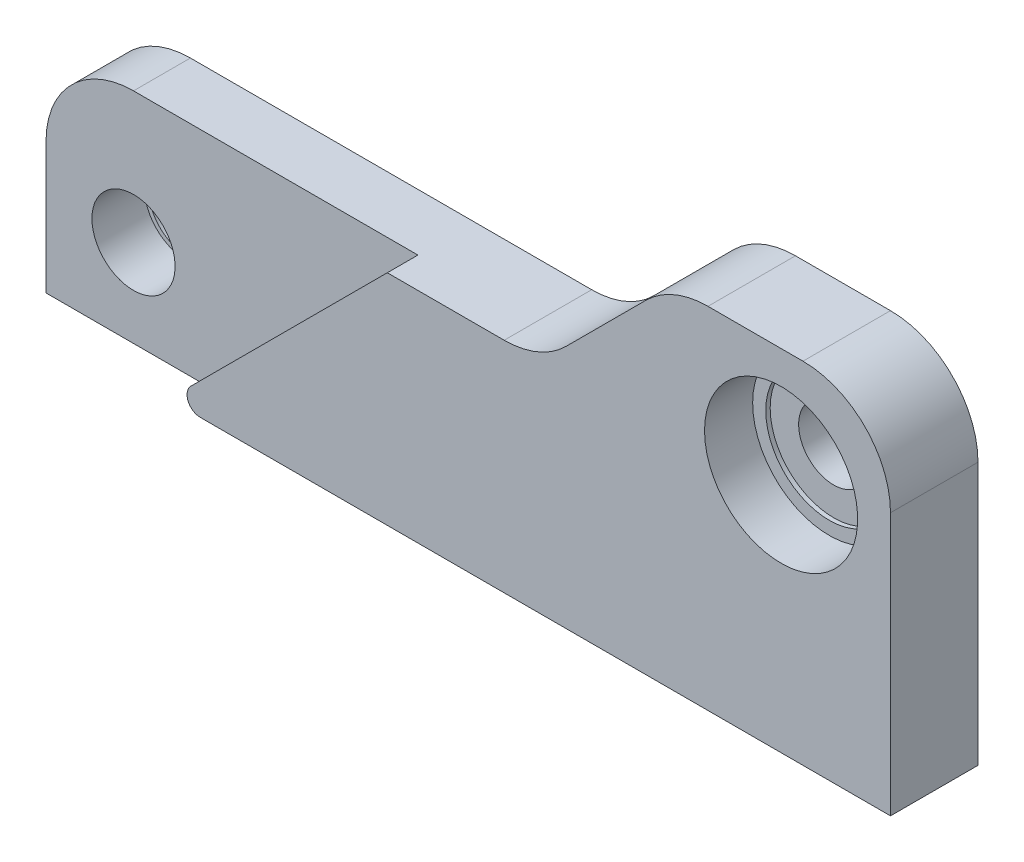
ISO-10303-21;
HEADER;
FILE_DESCRIPTION(('STEP AP214'),'2;1');
FILE_NAME('part.step','',(''),(''),'','','');
FILE_SCHEMA(('AUTOMOTIVE_DESIGN { 1 0 10303 214 1 1 1 1 }'));
ENDSEC;
DATA;
#1=APPLICATION_CONTEXT('core data for automotive mechanical design processes');
#2=APPLICATION_PROTOCOL_DEFINITION('international standard','automotive_design',2000,#1);
#3=PRODUCT_CONTEXT('',#1,'mechanical');
#4=PRODUCT('Part','Part','',(#3));
#5=PRODUCT_RELATED_PRODUCT_CATEGORY('part','',(#4));
#6=PRODUCT_DEFINITION_FORMATION('','',#4);
#7=PRODUCT_DEFINITION_CONTEXT('part definition',#1,'design');
#8=PRODUCT_DEFINITION('design','',#6,#7);
#9=PRODUCT_DEFINITION_SHAPE('','',#8);
#10=(LENGTH_UNIT() NAMED_UNIT(*) SI_UNIT(.MILLI.,.METRE.));
#11=(NAMED_UNIT(*) PLANE_ANGLE_UNIT() SI_UNIT($,.RADIAN.));
#12=(NAMED_UNIT(*) SI_UNIT($,.STERADIAN.) SOLID_ANGLE_UNIT());
#13=UNCERTAINTY_MEASURE_WITH_UNIT(LENGTH_MEASURE(1.E-05),#10,'distance_accuracy_value','');
#14=(GEOMETRIC_REPRESENTATION_CONTEXT(3) GLOBAL_UNCERTAINTY_ASSIGNED_CONTEXT((#13)) GLOBAL_UNIT_ASSIGNED_CONTEXT((#10,
#11,#12)) REPRESENTATION_CONTEXT('',''));
#15=CARTESIAN_POINT('',(0.,0.,0.));
#16=DIRECTION('',(0.,0.,1.));
#17=DIRECTION('',(1.,0.,0.));
#18=AXIS2_PLACEMENT_3D('',#15,#16,#17);
#19=CARTESIAN_POINT('',(175.,55.,-20.));
#20=DIRECTION('',(0.,0.,1.));
#21=DIRECTION('',(-1.,0.,0.));
#22=AXIS2_PLACEMENT_3D('',#19,#20,#21);
#23=CYLINDRICAL_SURFACE('',#22,8.00000000000001);
#24=CARTESIAN_POINT('',(175.,55.,-20.));
#25=DIRECTION('',(0.,0.,-1.));
#26=DIRECTION('',(-1.,0.,0.));
#27=AXIS2_PLACEMENT_3D('',#24,#25,#26);
#28=CIRCLE('',#27,8.00000000000001);
#29=CARTESIAN_POINT('',(167.,55.,-20.));
#30=VERTEX_POINT('',#29);
#31=EDGE_CURVE('E179',#30,#30,#28,.T.);
#32=ORIENTED_EDGE('',*,*,#31,.T.);
#33=EDGE_LOOP('',(#32));
#34=FACE_BOUND('',#33,.T.);
#35=CARTESIAN_POINT('',(175.,55.,-12.));
#36=DIRECTION('',(0.,0.,-1.));
#37=DIRECTION('',(-1.,0.,0.));
#38=AXIS2_PLACEMENT_3D('',#35,#36,#37);
#39=CIRCLE('',#38,8.00000000000001);
#40=CARTESIAN_POINT('',(167.,55.,-12.));
#41=VERTEX_POINT('',#40);
#42=EDGE_CURVE('E176',#41,#41,#39,.F.);
#43=ORIENTED_EDGE('',*,*,#42,.T.);
#44=EDGE_LOOP('',(#43));
#45=FACE_BOUND('',#44,.T.);
#46=ADVANCED_FACE('F35',(#34,#45),#23,.F.);
#47=CARTESIAN_POINT('',(0.,0.,-20.));
#48=DIRECTION('',(1.,0.,0.));
#49=DIRECTION('',(0.,0.,1.));
#50=AXIS2_PLACEMENT_3D('',#47,#48,#49);
#51=PLANE('',#50);
#52=DIRECTION('',(0.,-1.,0.));
#53=VECTOR('',#52,1.);
#54=CARTESIAN_POINT('',(0.,0.,-20.));
#55=LINE('',#54,#53);
#56=CARTESIAN_POINT('',(0.,30.,-20.));
#57=VERTEX_POINT('',#56);
#58=CARTESIAN_POINT('',(0.,0.,-20.));
#59=VERTEX_POINT('',#58);
#60=EDGE_CURVE('E189',#57,#59,#55,.T.);
#61=ORIENTED_EDGE('',*,*,#60,.T.);
#62=DIRECTION('',(0.,0.,1.));
#63=VECTOR('',#62,1.);
#64=CARTESIAN_POINT('',(0.,0.,-20.));
#65=LINE('',#64,#63);
#66=CARTESIAN_POINT('',(0.,0.,-7.));
#67=VERTEX_POINT('',#66);
#68=EDGE_CURVE('E212',#59,#67,#65,.T.);
#69=ORIENTED_EDGE('',*,*,#68,.T.);
#70=DIRECTION('',(0.,1.,0.));
#71=VECTOR('',#70,1.);
#72=CARTESIAN_POINT('',(0.,50.,-7.));
#73=LINE('',#72,#71);
#74=CARTESIAN_POINT('',(0.,30.,-7.));
#75=VERTEX_POINT('',#74);
#76=EDGE_CURVE('E156',#67,#75,#73,.T.);
#77=ORIENTED_EDGE('',*,*,#76,.T.);
#78=DIRECTION('',(0.,0.,-1.));
#79=VECTOR('',#78,1.);
#80=CARTESIAN_POINT('',(0.,30.,-20.));
#81=LINE('',#80,#79);
#82=EDGE_CURVE('E225',#57,#75,#81,.F.);
#83=ORIENTED_EDGE('',*,*,#82,.F.);
#84=EDGE_LOOP('',(#61,#69,#77,#83));
#85=FACE_BOUND('',#84,.T.);
#86=ADVANCED_FACE('F294',(#85),#51,.F.);
#87=CARTESIAN_POINT('',(0.,0.,-20.));
#88=DIRECTION('',(0.,1.,0.));
#89=DIRECTION('',(0.,0.,-1.));
#90=AXIS2_PLACEMENT_3D('',#87,#88,#89);
#91=PLANE('',#90);
#92=DIRECTION('',(-1.,0.,0.));
#93=VECTOR('',#92,1.);
#94=CARTESIAN_POINT('',(0.,0.,-7.));
#95=LINE('',#94,#93);
#96=CARTESIAN_POINT('',(42.2426406871193,0.,-7.));
#97=VERTEX_POINT('',#96);
#98=EDGE_CURVE('E141',#97,#67,#95,.T.);
#99=ORIENTED_EDGE('',*,*,#98,.T.);
#100=ORIENTED_EDGE('',*,*,#68,.F.);
#101=DIRECTION('',(1.,0.,0.));
#102=VECTOR('',#101,1.);
#103=CARTESIAN_POINT('',(0.,0.,-20.));
#104=LINE('',#103,#102);
#105=CARTESIAN_POINT('',(200.,0.,-20.));
#106=VERTEX_POINT('',#105);
#107=EDGE_CURVE('E192',#59,#106,#104,.T.);
#108=ORIENTED_EDGE('',*,*,#107,.T.);
#109=DIRECTION('',(0.,0.,1.));
#110=VECTOR('',#109,1.);
#111=CARTESIAN_POINT('',(200.,0.,-20.));
#112=LINE('',#111,#110);
#113=CARTESIAN_POINT('',(200.,0.,0.));
#114=VERTEX_POINT('',#113);
#115=EDGE_CURVE('E202',#106,#114,#112,.T.);
#116=ORIENTED_EDGE('',*,*,#115,.T.);
#117=DIRECTION('',(1.,0.,0.));
#118=VECTOR('',#117,1.);
#119=CARTESIAN_POINT('',(0.,0.,0.));
#120=LINE('',#119,#118);
#121=CARTESIAN_POINT('',(42.2426406871193,0.,0.));
#122=VERTEX_POINT('',#121);
#123=EDGE_CURVE('E186',#122,#114,#120,.T.);
#124=ORIENTED_EDGE('',*,*,#123,.F.);
#125=DIRECTION('',(0.,0.,1.));
#126=VECTOR('',#125,1.);
#127=CARTESIAN_POINT('',(42.2426406871193,0.,-20.));
#128=LINE('',#127,#126);
#129=EDGE_CURVE('E230',#97,#122,#128,.T.);
#130=ORIENTED_EDGE('',*,*,#129,.F.);
#131=EDGE_LOOP('',(#99,#100,#108,#116,#124,#130));
#132=FACE_BOUND('',#131,.T.);
#133=ADVANCED_FACE('F290',(#132),#91,.F.);
#134=CARTESIAN_POINT('',(200.,0.,-20.));
#135=DIRECTION('',(-1.,0.,0.));
#136=DIRECTION('',(0.,0.,-1.));
#137=AXIS2_PLACEMENT_3D('',#134,#135,#136);
#138=PLANE('',#137);
#139=DIRECTION('',(0.,1.,0.));
#140=VECTOR('',#139,1.);
#141=CARTESIAN_POINT('',(200.,0.,0.));
#142=LINE('',#141,#140);
#143=CARTESIAN_POINT('',(200.,60.,0.));
#144=VERTEX_POINT('',#143);
#145=EDGE_CURVE('E205',#114,#144,#142,.T.);
#146=ORIENTED_EDGE('',*,*,#145,.F.);
#147=ORIENTED_EDGE('',*,*,#115,.F.);
#148=DIRECTION('',(0.,1.,0.));
#149=VECTOR('',#148,1.);
#150=CARTESIAN_POINT('',(200.,0.,-20.));
#151=LINE('',#150,#149);
#152=CARTESIAN_POINT('',(200.,60.,-20.));
#153=VERTEX_POINT('',#152);
#154=EDGE_CURVE('E196',#106,#153,#151,.T.);
#155=ORIENTED_EDGE('',*,*,#154,.T.);
#156=DIRECTION('',(0.,0.,1.));
#157=VECTOR('',#156,1.);
#158=CARTESIAN_POINT('',(200.,60.,-20.));
#159=LINE('',#158,#157);
#160=EDGE_CURVE('E249',#144,#153,#159,.F.);
#161=ORIENTED_EDGE('',*,*,#160,.F.);
#162=EDGE_LOOP('',(#146,#147,#155,#161));
#163=FACE_BOUND('',#162,.T.);
#164=ADVANCED_FACE('F287',(#163),#138,.F.);
#165=CARTESIAN_POINT('',(0.,80.,-20.));
#166=DIRECTION('',(0.,-1.,0.));
#167=DIRECTION('',(0.,0.,1.));
#168=AXIS2_PLACEMENT_3D('',#165,#166,#167);
#169=PLANE('',#168);
#170=DIRECTION('',(-1.,0.,0.));
#171=VECTOR('',#170,1.);
#172=CARTESIAN_POINT('',(0.,80.,-20.));
#173=LINE('',#172,#171);
#174=CARTESIAN_POINT('',(180.,80.,-20.));
#175=VERTEX_POINT('',#174);
#176=CARTESIAN_POINT('',(158.284271247462,80.,-20.));
#177=VERTEX_POINT('',#176);
#178=EDGE_CURVE('E199',#175,#177,#173,.T.);
#179=ORIENTED_EDGE('',*,*,#178,.T.);
#180=DIRECTION('',(0.,0.,-1.));
#181=VECTOR('',#180,1.);
#182=CARTESIAN_POINT('',(158.284271247462,80.,-20.));
#183=LINE('',#182,#181);
#184=CARTESIAN_POINT('',(158.284271247462,80.,0.));
#185=VERTEX_POINT('',#184);
#186=EDGE_CURVE('E239',#185,#177,#183,.T.);
#187=ORIENTED_EDGE('',*,*,#186,.F.);
#188=DIRECTION('',(-1.,0.,0.));
#189=VECTOR('',#188,1.);
#190=CARTESIAN_POINT('',(0.,80.,0.));
#191=LINE('',#190,#189);
#192=CARTESIAN_POINT('',(180.,80.,0.));
#193=VERTEX_POINT('',#192);
#194=EDGE_CURVE('E193',#193,#185,#191,.T.);
#195=ORIENTED_EDGE('',*,*,#194,.F.);
#196=DIRECTION('',(0.,0.,1.));
#197=VECTOR('',#196,1.);
#198=CARTESIAN_POINT('',(180.,80.,-20.));
#199=LINE('',#198,#197);
#200=EDGE_CURVE('E242',#175,#193,#199,.T.);
#201=ORIENTED_EDGE('',*,*,#200,.F.);
#202=EDGE_LOOP('',(#179,#187,#195,#201));
#203=FACE_BOUND('',#202,.T.);
#204=ADVANCED_FACE('F280',(#203),#169,.F.);
#205=CARTESIAN_POINT('',(0.,0.,-20.));
#206=DIRECTION('',(0.,0.,1.));
#207=DIRECTION('',(-1.,0.,0.));
#208=AXIS2_PLACEMENT_3D('',#205,#206,#207);
#209=PLANE('',#208);
#210=CARTESIAN_POINT('',(20.,20.,-20.));
#211=DIRECTION('',(0.,0.,-1.));
#212=DIRECTION('',(-1.,0.,0.));
#213=AXIS2_PLACEMENT_3D('',#210,#211,#212);
#214=CIRCLE('',#213,8.5);
#215=CARTESIAN_POINT('',(11.5,20.,-20.));
#216=VERTEX_POINT('',#215);
#217=EDGE_CURVE('E221',#216,#216,#214,.T.);
#218=ORIENTED_EDGE('',*,*,#217,.F.);
#219=EDGE_LOOP('',(#218));
#220=FACE_BOUND('',#219,.T.);
#221=ORIENTED_EDGE('',*,*,#31,.F.);
#222=EDGE_LOOP('',(#221));
#223=FACE_BOUND('',#222,.T.);
#224=ORIENTED_EDGE('',*,*,#154,.F.);
#225=ORIENTED_EDGE('',*,*,#107,.F.);
#226=ORIENTED_EDGE('',*,*,#60,.F.);
#227=CARTESIAN_POINT('',(20.,30.,-20.));
#228=DIRECTION('',(0.,0.,-1.));
#229=DIRECTION('',(-1.,0.,0.));
#230=AXIS2_PLACEMENT_3D('',#227,#228,#229);
#231=CIRCLE('',#230,20.);
#232=CARTESIAN_POINT('',(20.,50.,-20.));
#233=VERTEX_POINT('',#232);
#234=EDGE_CURVE('E223',#233,#57,#231,.F.);
#235=ORIENTED_EDGE('',*,*,#234,.F.);
#236=DIRECTION('',(-1.,0.,0.));
#237=VECTOR('',#236,1.);
#238=CARTESIAN_POINT('',(0.,50.,-20.));
#239=LINE('',#238,#237);
#240=CARTESIAN_POINT('',(111.715728752538,50.,-20.));
#241=VERTEX_POINT('',#240);
#242=EDGE_CURVE('E168',#241,#233,#239,.T.);
#243=ORIENTED_EDGE('',*,*,#242,.F.);
#244=CARTESIAN_POINT('',(111.715728752538,70.,-20.));
#245=DIRECTION('',(0.,0.,-1.));
#246=DIRECTION('',(-1.,0.,0.));
#247=AXIS2_PLACEMENT_3D('',#244,#245,#246);
#248=CIRCLE('',#247,20.);
#249=CARTESIAN_POINT('',(125.857864376269,55.8578643762691,-20.));
#250=VERTEX_POINT('',#249);
#251=EDGE_CURVE('E43',#250,#241,#248,.T.);
#252=ORIENTED_EDGE('',*,*,#251,.F.);
#253=DIRECTION('',(-0.707106781186546,-0.707106781186549,0.));
#254=VECTOR('',#253,1.);
#255=CARTESIAN_POINT('',(35.0000000000002,-35.0000000000001,-20.));
#256=LINE('',#255,#254);
#257=CARTESIAN_POINT('',(144.142135623731,74.1421356237309,-20.));
#258=VERTEX_POINT('',#257);
#259=EDGE_CURVE('E170',#258,#250,#256,.T.);
#260=ORIENTED_EDGE('',*,*,#259,.F.);
#261=CARTESIAN_POINT('',(158.284271247462,60.,-20.));
#262=DIRECTION('',(0.,0.,-1.));
#263=DIRECTION('',(-1.,0.,0.));
#264=AXIS2_PLACEMENT_3D('',#261,#262,#263);
#265=CIRCLE('',#264,20.);
#266=EDGE_CURVE('E252',#177,#258,#265,.F.);
#267=ORIENTED_EDGE('',*,*,#266,.F.);
#268=ORIENTED_EDGE('',*,*,#178,.F.);
#269=CARTESIAN_POINT('',(180.,60.,-20.));
#270=DIRECTION('',(0.,0.,-1.));
#271=DIRECTION('',(-1.,0.,0.));
#272=AXIS2_PLACEMENT_3D('',#269,#270,#271);
#273=CIRCLE('',#272,20.);
#274=EDGE_CURVE('E254',#153,#175,#273,.F.);
#275=ORIENTED_EDGE('',*,*,#274,.F.);
#276=EDGE_LOOP('',(#224,#225,#226,#235,#243,#252,#260,#267,#268,#275));
#277=FACE_BOUND('',#276,.T.);
#278=ADVANCED_FACE('F264',(#220,#223,#277),#209,.F.);
#279=CARTESIAN_POINT('',(0.,0.,0.));
#280=DIRECTION('',(0.,0.,1.));
#281=DIRECTION('',(-1.,0.,0.));
#282=AXIS2_PLACEMENT_3D('',#279,#280,#281);
#283=PLANE('',#282);
#284=ORIENTED_EDGE('',*,*,#194,.T.);
#285=CARTESIAN_POINT('',(158.284271247462,60.,0.));
#286=DIRECTION('',(0.,0.,-1.));
#287=DIRECTION('',(-1.,0.,0.));
#288=AXIS2_PLACEMENT_3D('',#285,#286,#287);
#289=CIRCLE('',#288,20.);
#290=CARTESIAN_POINT('',(144.142135623731,74.1421356237309,0.));
#291=VERTEX_POINT('',#290);
#292=EDGE_CURVE('E245',#291,#185,#289,.T.);
#293=ORIENTED_EDGE('',*,*,#292,.F.);
#294=DIRECTION('',(0.707106781186546,0.707106781186549,0.));
#295=VECTOR('',#294,1.);
#296=CARTESIAN_POINT('',(120.,50.,0.));
#297=LINE('',#296,#295);
#298=CARTESIAN_POINT('',(125.857864376269,55.8578643762691,0.));
#299=VERTEX_POINT('',#298);
#300=EDGE_CURVE('E166',#299,#291,#297,.T.);
#301=ORIENTED_EDGE('',*,*,#300,.F.);
#302=CARTESIAN_POINT('',(111.715728752538,70.,0.));
#303=DIRECTION('',(0.,0.,-1.));
#304=DIRECTION('',(-1.,0.,0.));
#305=AXIS2_PLACEMENT_3D('',#302,#303,#304);
#306=CIRCLE('',#305,20.);
#307=CARTESIAN_POINT('',(111.715728752538,50.,0.));
#308=VERTEX_POINT('',#307);
#309=EDGE_CURVE('E12',#308,#299,#306,.F.);
#310=ORIENTED_EDGE('',*,*,#309,.F.);
#311=DIRECTION('',(1.,0.,0.));
#312=VECTOR('',#311,1.);
#313=CARTESIAN_POINT('',(0.,50.,0.));
#314=LINE('',#313,#312);
#315=CARTESIAN_POINT('',(85.0000000000006,50.,0.));
#316=VERTEX_POINT('',#315);
#317=EDGE_CURVE('E151',#316,#308,#314,.T.);
#318=ORIENTED_EDGE('',*,*,#317,.F.);
#319=DIRECTION('',(-0.707106781186551,-0.707106781186544,0.));
#320=VECTOR('',#319,1.);
#321=CARTESIAN_POINT('',(35.,0.,0.));
#322=LINE('',#321,#320);
#323=CARTESIAN_POINT('',(40.1213203435597,5.12132034355965,0.));
#324=VERTEX_POINT('',#323);
#325=EDGE_CURVE('E147',#316,#324,#322,.T.);
#326=ORIENTED_EDGE('',*,*,#325,.T.);
#327=CARTESIAN_POINT('',(42.2426406871193,3.,0.));
#328=DIRECTION('',(0.,0.,-1.));
#329=DIRECTION('',(-1.,0.,0.));
#330=AXIS2_PLACEMENT_3D('',#327,#328,#329);
#331=CIRCLE('',#330,3.);
#332=EDGE_CURVE('E233',#122,#324,#331,.T.);
#333=ORIENTED_EDGE('',*,*,#332,.F.);
#334=ORIENTED_EDGE('',*,*,#123,.T.);
#335=ORIENTED_EDGE('',*,*,#145,.T.);
#336=CARTESIAN_POINT('',(180.,60.,0.));
#337=DIRECTION('',(0.,0.,-1.));
#338=DIRECTION('',(-1.,0.,0.));
#339=AXIS2_PLACEMENT_3D('',#336,#337,#338);
#340=CIRCLE('',#339,20.);
#341=EDGE_CURVE('E247',#193,#144,#340,.T.);
#342=ORIENTED_EDGE('',*,*,#341,.F.);
#343=EDGE_LOOP('',(#284,#293,#301,#310,#318,#326,#333,#334,#335,#342));
#344=FACE_BOUND('',#343,.T.);
#345=CARTESIAN_POINT('',(175.,55.,0.));
#346=DIRECTION('',(0.,0.,-1.));
#347=DIRECTION('',(-1.,0.,0.));
#348=AXIS2_PLACEMENT_3D('',#345,#346,#347);
#349=CIRCLE('',#348,17.5);
#350=CARTESIAN_POINT('',(157.5,55.,0.));
#351=VERTEX_POINT('',#350);
#352=EDGE_CURVE('E182',#351,#351,#349,.T.);
#353=ORIENTED_EDGE('',*,*,#352,.T.);
#354=EDGE_LOOP('',(#353));
#355=FACE_BOUND('',#354,.T.);
#356=ADVANCED_FACE('F269',(#344,#355),#283,.T.);
#357=CARTESIAN_POINT('',(175.,55.,-11.));
#358=DIRECTION('',(0.,0.,1.));
#359=DIRECTION('',(-1.,0.,0.));
#360=AXIS2_PLACEMENT_3D('',#357,#358,#359);
#361=CYLINDRICAL_SURFACE('',#360,17.5);
#362=CARTESIAN_POINT('',(175.,55.,-11.));
#363=DIRECTION('',(0.,0.,-1.));
#364=DIRECTION('',(-1.,0.,0.));
#365=AXIS2_PLACEMENT_3D('',#362,#363,#364);
#366=CIRCLE('',#365,17.5);
#367=CARTESIAN_POINT('',(157.5,55.,-11.));
#368=VERTEX_POINT('',#367);
#369=EDGE_CURVE('E183',#368,#368,#366,.T.);
#370=ORIENTED_EDGE('',*,*,#369,.T.);
#371=EDGE_LOOP('',(#370));
#372=FACE_BOUND('',#371,.T.);
#373=ORIENTED_EDGE('',*,*,#352,.F.);
#374=EDGE_LOOP('',(#373));
#375=FACE_BOUND('',#374,.T.);
#376=ADVANCED_FACE('F326',(#372,#375),#361,.F.);
#377=CARTESIAN_POINT('',(175.,55.,-11.));
#378=DIRECTION('',(0.,0.,1.));
#379=DIRECTION('',(-1.,0.,0.));
#380=AXIS2_PLACEMENT_3D('',#377,#378,#379);
#381=PLANE('',#380);
#382=CARTESIAN_POINT('',(175.,55.,-11.));
#383=DIRECTION('',(0.,0.,-1.));
#384=DIRECTION('',(-1.,0.,0.));
#385=AXIS2_PLACEMENT_3D('',#382,#383,#384);
#386=CIRCLE('',#385,14.5);
#387=CARTESIAN_POINT('',(160.5,55.,-11.));
#388=VERTEX_POINT('',#387);
#389=EDGE_CURVE('E172',#388,#388,#386,.T.);
#390=ORIENTED_EDGE('',*,*,#389,.T.);
#391=EDGE_LOOP('',(#390));
#392=FACE_BOUND('',#391,.T.);
#393=ORIENTED_EDGE('',*,*,#369,.F.);
#394=EDGE_LOOP('',(#393));
#395=FACE_BOUND('',#394,.T.);
#396=ADVANCED_FACE('F322',(#392,#395),#381,.T.);
#397=CARTESIAN_POINT('',(175.,55.,-12.));
#398=DIRECTION('',(0.,0.,1.));
#399=DIRECTION('',(-1.,0.,0.));
#400=AXIS2_PLACEMENT_3D('',#397,#398,#399);
#401=PLANE('',#400);
#402=CARTESIAN_POINT('',(175.,55.,-12.));
#403=DIRECTION('',(0.,0.,-1.));
#404=DIRECTION('',(-1.,0.,0.));
#405=AXIS2_PLACEMENT_3D('',#402,#403,#404);
#406=CIRCLE('',#405,14.5);
#407=CARTESIAN_POINT('',(160.5,55.,-12.));
#408=VERTEX_POINT('',#407);
#409=EDGE_CURVE('E173',#408,#408,#406,.T.);
#410=ORIENTED_EDGE('',*,*,#409,.F.);
#411=EDGE_LOOP('',(#410));
#412=FACE_BOUND('',#411,.T.);
#413=ORIENTED_EDGE('',*,*,#42,.F.);
#414=EDGE_LOOP('',(#413));
#415=FACE_BOUND('',#414,.T.);
#416=ADVANCED_FACE('F325',(#412,#415),#401,.T.);
#417=CARTESIAN_POINT('',(175.,55.,-12.));
#418=DIRECTION('',(0.,0.,1.));
#419=DIRECTION('',(-1.,0.,0.));
#420=AXIS2_PLACEMENT_3D('',#417,#418,#419);
#421=CYLINDRICAL_SURFACE('',#420,14.5);
#422=ORIENTED_EDGE('',*,*,#409,.T.);
#423=EDGE_LOOP('',(#422));
#424=FACE_BOUND('',#423,.T.);
#425=ORIENTED_EDGE('',*,*,#389,.F.);
#426=EDGE_LOOP('',(#425));
#427=FACE_BOUND('',#426,.T.);
#428=ADVANCED_FACE('F320',(#424,#427),#421,.F.);
#429=CARTESIAN_POINT('',(120.,50.,0.));
#430=DIRECTION('',(0.707106781186549,-0.707106781186546,0.));
#431=DIRECTION('',(0.707106781186546,0.707106781186549,0.));
#432=AXIS2_PLACEMENT_3D('',#429,#430,#431);
#433=PLANE('',#432);
#434=ORIENTED_EDGE('',*,*,#259,.T.);
#435=DIRECTION('',(0.,0.,-1.));
#436=VECTOR('',#435,1.);
#437=CARTESIAN_POINT('',(125.857864376269,55.8578643762691,-20.));
#438=LINE('',#437,#436);
#439=EDGE_CURVE('E49',#299,#250,#438,.T.);
#440=ORIENTED_EDGE('',*,*,#439,.F.);
#441=ORIENTED_EDGE('',*,*,#300,.T.);
#442=DIRECTION('',(0.,0.,-1.));
#443=VECTOR('',#442,1.);
#444=CARTESIAN_POINT('',(144.142135623731,74.1421356237309,0.));
#445=LINE('',#444,#443);
#446=EDGE_CURVE('E56',#258,#291,#445,.F.);
#447=ORIENTED_EDGE('',*,*,#446,.F.);
#448=EDGE_LOOP('',(#434,#440,#441,#447));
#449=FACE_BOUND('',#448,.T.);
#450=ADVANCED_FACE('F272',(#449),#433,.F.);
#451=CARTESIAN_POINT('',(0.,50.,0.));
#452=DIRECTION('',(0.,-1.,0.));
#453=DIRECTION('',(0.,0.,1.));
#454=AXIS2_PLACEMENT_3D('',#451,#452,#453);
#455=PLANE('',#454);
#456=ORIENTED_EDGE('',*,*,#242,.T.);
#457=DIRECTION('',(0.,0.,-1.));
#458=VECTOR('',#457,1.);
#459=CARTESIAN_POINT('',(20.,50.,0.));
#460=LINE('',#459,#458);
#461=CARTESIAN_POINT('',(20.,50.,-7.));
#462=VERTEX_POINT('',#461);
#463=EDGE_CURVE('E155',#462,#233,#460,.T.);
#464=ORIENTED_EDGE('',*,*,#463,.F.);
#465=DIRECTION('',(1.,0.,0.));
#466=VECTOR('',#465,1.);
#467=CARTESIAN_POINT('',(85.0000000000006,50.,-7.));
#468=LINE('',#467,#466);
#469=CARTESIAN_POINT('',(85.0000000000006,50.,-7.));
#470=VERTEX_POINT('',#469);
#471=EDGE_CURVE('E135',#462,#470,#468,.T.);
#472=ORIENTED_EDGE('',*,*,#471,.T.);
#473=DIRECTION('',(0.,0.,1.));
#474=VECTOR('',#473,1.);
#475=CARTESIAN_POINT('',(85.0000000000006,50.,-7.));
#476=LINE('',#475,#474);
#477=EDGE_CURVE('E144',#470,#316,#476,.T.);
#478=ORIENTED_EDGE('',*,*,#477,.T.);
#479=ORIENTED_EDGE('',*,*,#317,.T.);
#480=DIRECTION('',(0.,0.,-1.));
#481=VECTOR('',#480,1.);
#482=CARTESIAN_POINT('',(111.715728752538,50.,0.));
#483=LINE('',#482,#481);
#484=EDGE_CURVE('E258',#241,#308,#483,.F.);
#485=ORIENTED_EDGE('',*,*,#484,.F.);
#486=EDGE_LOOP('',(#456,#464,#472,#478,#479,#485));
#487=FACE_BOUND('',#486,.T.);
#488=ADVANCED_FACE('F154',(#487),#455,.F.);
#489=CARTESIAN_POINT('',(35.,0.,-7.));
#490=DIRECTION('',(0.707106781186544,-0.707106781186551,0.));
#491=DIRECTION('',(0.707106781186551,0.707106781186544,0.));
#492=AXIS2_PLACEMENT_3D('',#489,#490,#491);
#493=PLANE('',#492);
#494=ORIENTED_EDGE('',*,*,#325,.F.);
#495=ORIENTED_EDGE('',*,*,#477,.F.);
#496=DIRECTION('',(-0.707106781186551,-0.707106781186544,0.));
#497=VECTOR('',#496,1.);
#498=CARTESIAN_POINT('',(35.,0.,-7.));
#499=LINE('',#498,#497);
#500=CARTESIAN_POINT('',(40.1213203435597,5.12132034355965,-7.));
#501=VERTEX_POINT('',#500);
#502=EDGE_CURVE('E130',#470,#501,#499,.T.);
#503=ORIENTED_EDGE('',*,*,#502,.T.);
#504=DIRECTION('',(0.,0.,1.));
#505=VECTOR('',#504,1.);
#506=CARTESIAN_POINT('',(40.1213203435597,5.12132034355965,-7.));
#507=LINE('',#506,#505);
#508=EDGE_CURVE('E236',#324,#501,#507,.F.);
#509=ORIENTED_EDGE('',*,*,#508,.F.);
#510=EDGE_LOOP('',(#494,#495,#503,#509));
#511=FACE_BOUND('',#510,.T.);
#512=ADVANCED_FACE('F145',(#511),#493,.F.);
#513=CARTESIAN_POINT('',(0.,0.,-7.));
#514=DIRECTION('',(0.,0.,-1.));
#515=DIRECTION('',(1.,0.,0.));
#516=AXIS2_PLACEMENT_3D('',#513,#514,#515);
#517=PLANE('',#516);
#518=CARTESIAN_POINT('',(20.,20.,-7.));
#519=DIRECTION('',(0.,0.,-1.));
#520=DIRECTION('',(-1.,0.,0.));
#521=AXIS2_PLACEMENT_3D('',#518,#519,#520);
#522=CIRCLE('',#521,9.5);
#523=CARTESIAN_POINT('',(10.5,20.,-7.));
#524=VERTEX_POINT('',#523);
#525=EDGE_CURVE('E220',#524,#524,#522,.T.);
#526=ORIENTED_EDGE('',*,*,#525,.T.);
#527=EDGE_LOOP('',(#526));
#528=FACE_BOUND('',#527,.T.);
#529=ORIENTED_EDGE('',*,*,#76,.F.);
#530=ORIENTED_EDGE('',*,*,#98,.F.);
#531=CARTESIAN_POINT('',(42.2426406871193,3.,-7.));
#532=DIRECTION('',(0.,0.,1.));
#533=DIRECTION('',(1.,0.,0.));
#534=AXIS2_PLACEMENT_3D('',#531,#532,#533);
#535=CIRCLE('',#534,3.);
#536=EDGE_CURVE('E138',#501,#97,#535,.T.);
#537=ORIENTED_EDGE('',*,*,#536,.F.);
#538=ORIENTED_EDGE('',*,*,#502,.F.);
#539=ORIENTED_EDGE('',*,*,#471,.F.);
#540=CARTESIAN_POINT('',(20.,30.,-7.));
#541=DIRECTION('',(0.,0.,1.));
#542=DIRECTION('',(1.,0.,0.));
#543=AXIS2_PLACEMENT_3D('',#540,#541,#542);
#544=CIRCLE('',#543,20.);
#545=EDGE_CURVE('E228',#75,#462,#544,.F.);
#546=ORIENTED_EDGE('',*,*,#545,.F.);
#547=EDGE_LOOP('',(#529,#530,#537,#538,#539,#546));
#548=FACE_BOUND('',#547,.T.);
#549=ADVANCED_FACE('F133',(#528,#548),#517,.F.);
#550=CARTESIAN_POINT('',(20.,20.,-19.));
#551=DIRECTION('',(0.,0.,1.));
#552=DIRECTION('',(-1.,0.,0.));
#553=AXIS2_PLACEMENT_3D('',#550,#551,#552);
#554=CYLINDRICAL_SURFACE('',#553,9.5);
#555=CARTESIAN_POINT('',(20.,20.,-19.));
#556=DIRECTION('',(0.,0.,-1.));
#557=DIRECTION('',(-1.,0.,0.));
#558=AXIS2_PLACEMENT_3D('',#555,#556,#557);
#559=CIRCLE('',#558,9.5);
#560=CARTESIAN_POINT('',(10.5,20.,-19.));
#561=VERTEX_POINT('',#560);
#562=EDGE_CURVE('E163',#561,#561,#559,.T.);
#563=ORIENTED_EDGE('',*,*,#562,.T.);
#564=EDGE_LOOP('',(#563));
#565=FACE_BOUND('',#564,.T.);
#566=ORIENTED_EDGE('',*,*,#525,.F.);
#567=EDGE_LOOP('',(#566));
#568=FACE_BOUND('',#567,.T.);
#569=ADVANCED_FACE('F406',(#565,#568),#554,.F.);
#570=CARTESIAN_POINT('',(20.,20.,-19.));
#571=DIRECTION('',(0.,0.,1.));
#572=DIRECTION('',(-1.,0.,0.));
#573=AXIS2_PLACEMENT_3D('',#570,#571,#572);
#574=PLANE('',#573);
#575=CARTESIAN_POINT('',(20.,20.,-19.));
#576=DIRECTION('',(0.,0.,-1.));
#577=DIRECTION('',(-1.,0.,0.));
#578=AXIS2_PLACEMENT_3D('',#575,#576,#577);
#579=CIRCLE('',#578,8.5);
#580=CARTESIAN_POINT('',(11.5,20.,-19.));
#581=VERTEX_POINT('',#580);
#582=EDGE_CURVE('E217',#581,#581,#579,.T.);
#583=ORIENTED_EDGE('',*,*,#582,.T.);
#584=EDGE_LOOP('',(#583));
#585=FACE_BOUND('',#584,.T.);
#586=ORIENTED_EDGE('',*,*,#562,.F.);
#587=EDGE_LOOP('',(#586));
#588=FACE_BOUND('',#587,.T.);
#589=ADVANCED_FACE('F307',(#585,#588),#574,.T.);
#590=CARTESIAN_POINT('',(20.,20.,-20.));
#591=DIRECTION('',(0.,0.,1.));
#592=DIRECTION('',(-1.,0.,0.));
#593=AXIS2_PLACEMENT_3D('',#590,#591,#592);
#594=CYLINDRICAL_SURFACE('',#593,8.5);
#595=ORIENTED_EDGE('',*,*,#582,.F.);
#596=EDGE_LOOP('',(#595));
#597=FACE_BOUND('',#596,.T.);
#598=ORIENTED_EDGE('',*,*,#217,.T.);
#599=EDGE_LOOP('',(#598));
#600=FACE_BOUND('',#599,.T.);
#601=ADVANCED_FACE('F299',(#597,#600),#594,.F.);
#602=CARTESIAN_POINT('',(20.,30.,0.));
#603=DIRECTION('',(0.,0.,-1.));
#604=DIRECTION('',(1.,0.,0.));
#605=AXIS2_PLACEMENT_3D('',#602,#603,#604);
#606=CYLINDRICAL_SURFACE('',#605,20.);
#607=ORIENTED_EDGE('',*,*,#545,.T.);
#608=ORIENTED_EDGE('',*,*,#463,.T.);
#609=ORIENTED_EDGE('',*,*,#234,.T.);
#610=ORIENTED_EDGE('',*,*,#82,.T.);
#611=EDGE_LOOP('',(#607,#608,#609,#610));
#612=FACE_BOUND('',#611,.T.);
#613=ADVANCED_FACE('F296',(#612),#606,.T.);
#614=CARTESIAN_POINT('',(42.2426406871193,3.,-20.));
#615=DIRECTION('',(0.,0.,1.));
#616=DIRECTION('',(-1.,0.,0.));
#617=AXIS2_PLACEMENT_3D('',#614,#615,#616);
#618=CYLINDRICAL_SURFACE('',#617,3.);
#619=ORIENTED_EDGE('',*,*,#536,.T.);
#620=ORIENTED_EDGE('',*,*,#129,.T.);
#621=ORIENTED_EDGE('',*,*,#332,.T.);
#622=ORIENTED_EDGE('',*,*,#508,.T.);
#623=EDGE_LOOP('',(#619,#620,#621,#622));
#624=FACE_BOUND('',#623,.T.);
#625=ADVANCED_FACE('F298',(#624),#618,.T.);
#626=CARTESIAN_POINT('',(180.,60.,-20.));
#627=DIRECTION('',(0.,0.,1.));
#628=DIRECTION('',(-1.,0.,0.));
#629=AXIS2_PLACEMENT_3D('',#626,#627,#628);
#630=CYLINDRICAL_SURFACE('',#629,20.);
#631=ORIENTED_EDGE('',*,*,#274,.T.);
#632=ORIENTED_EDGE('',*,*,#200,.T.);
#633=ORIENTED_EDGE('',*,*,#341,.T.);
#634=ORIENTED_EDGE('',*,*,#160,.T.);
#635=EDGE_LOOP('',(#631,#632,#633,#634));
#636=FACE_BOUND('',#635,.T.);
#637=ADVANCED_FACE('F282',(#636),#630,.T.);
#638=CARTESIAN_POINT('',(158.284271247462,60.,-20.));
#639=DIRECTION('',(0.,0.,-1.));
#640=DIRECTION('',(1.,0.,0.));
#641=AXIS2_PLACEMENT_3D('',#638,#639,#640);
#642=CYLINDRICAL_SURFACE('',#641,20.);
#643=ORIENTED_EDGE('',*,*,#292,.T.);
#644=ORIENTED_EDGE('',*,*,#186,.T.);
#645=ORIENTED_EDGE('',*,*,#266,.T.);
#646=ORIENTED_EDGE('',*,*,#446,.T.);
#647=EDGE_LOOP('',(#643,#644,#645,#646));
#648=FACE_BOUND('',#647,.T.);
#649=ADVANCED_FACE('F276',(#648),#642,.T.);
#650=CARTESIAN_POINT('',(111.715728752538,70.,0.));
#651=DIRECTION('',(0.,0.,1.));
#652=DIRECTION('',(-1.,0.,0.));
#653=AXIS2_PLACEMENT_3D('',#650,#651,#652);
#654=CYLINDRICAL_SURFACE('',#653,20.);
#655=ORIENTED_EDGE('',*,*,#309,.T.);
#656=ORIENTED_EDGE('',*,*,#439,.T.);
#657=ORIENTED_EDGE('',*,*,#251,.T.);
#658=ORIENTED_EDGE('',*,*,#484,.T.);
#659=EDGE_LOOP('',(#655,#656,#657,#658));
#660=FACE_BOUND('',#659,.T.);
#661=ADVANCED_FACE('F37',(#660),#654,.F.);
#662=CLOSED_SHELL('',(#46,#86,#133,#164,#204,#278,#356,#376,#396,#416,#428,#450,#488,#512,#549,
#569,#589,#601,#613,#625,#637,#649,#661));
#663=MANIFOLD_SOLID_BREP('B2',#662);
#664=ADVANCED_BREP_SHAPE_REPRESENTATION('',(#18,#663),#14);
#665=SHAPE_DEFINITION_REPRESENTATION(#9,#664);
ENDSEC;
END-ISO-10303-21;
